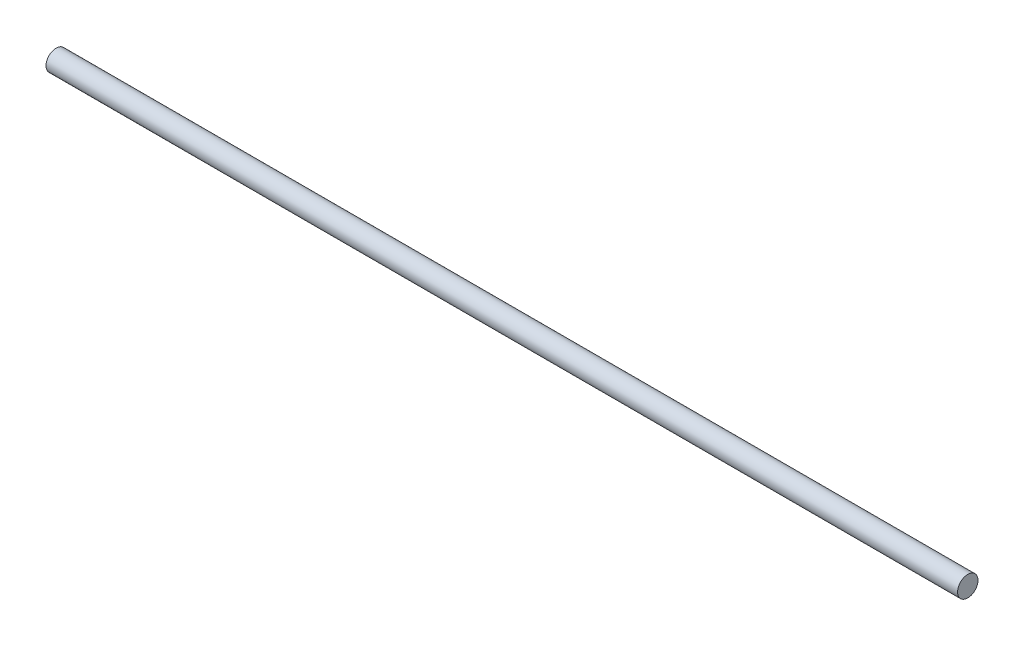
ISO-10303-21;
HEADER;
FILE_DESCRIPTION(('STEP AP214'),'2;1');
FILE_NAME('part.step','',(''),(''),'','','');
FILE_SCHEMA(('AUTOMOTIVE_DESIGN { 1 0 10303 214 1 1 1 1 }'));
ENDSEC;
DATA;
#1=APPLICATION_CONTEXT('core data for automotive mechanical design processes');
#2=APPLICATION_PROTOCOL_DEFINITION('international standard','automotive_design',2000,#1);
#3=PRODUCT_CONTEXT('',#1,'mechanical');
#4=PRODUCT('Part','Part','',(#3));
#5=PRODUCT_RELATED_PRODUCT_CATEGORY('part','',(#4));
#6=PRODUCT_DEFINITION_FORMATION('','',#4);
#7=PRODUCT_DEFINITION_CONTEXT('part definition',#1,'design');
#8=PRODUCT_DEFINITION('design','',#6,#7);
#9=PRODUCT_DEFINITION_SHAPE('','',#8);
#10=(LENGTH_UNIT() NAMED_UNIT(*) SI_UNIT(.MILLI.,.METRE.));
#11=(NAMED_UNIT(*) PLANE_ANGLE_UNIT() SI_UNIT($,.RADIAN.));
#12=(NAMED_UNIT(*) SI_UNIT($,.STERADIAN.) SOLID_ANGLE_UNIT());
#13=UNCERTAINTY_MEASURE_WITH_UNIT(LENGTH_MEASURE(1.E-05),#10,'distance_accuracy_value','');
#14=(GEOMETRIC_REPRESENTATION_CONTEXT(3) GLOBAL_UNCERTAINTY_ASSIGNED_CONTEXT((#13)) GLOBAL_UNIT_ASSIGNED_CONTEXT((#10,
#11,#12)) REPRESENTATION_CONTEXT('',''));
#15=CARTESIAN_POINT('',(0.,0.,0.));
#16=DIRECTION('',(0.,0.,1.));
#17=DIRECTION('',(1.,0.,0.));
#18=AXIS2_PLACEMENT_3D('',#15,#16,#17);
#19=CARTESIAN_POINT('',(178.5,0.,0.));
#20=DIRECTION('',(-1.,0.,0.));
#21=DIRECTION('',(0.,0.,1.));
#22=AXIS2_PLACEMENT_3D('',#19,#20,#21);
#23=CYLINDRICAL_SURFACE('',#22,4.);
#24=CARTESIAN_POINT('',(178.5,0.,0.));
#25=DIRECTION('',(1.,0.,0.));
#26=DIRECTION('',(0.,0.,-1.));
#27=AXIS2_PLACEMENT_3D('',#24,#25,#26);
#28=CIRCLE('',#27,4.);
#29=CARTESIAN_POINT('',(178.5,0.,-4.));
#30=VERTEX_POINT('',#29);
#31=EDGE_CURVE('E10',#30,#30,#28,.T.);
#32=ORIENTED_EDGE('',*,*,#31,.F.);
#33=EDGE_LOOP('',(#32));
#34=FACE_BOUND('',#33,.T.);
#35=CARTESIAN_POINT('',(-178.5,0.,0.));
#36=DIRECTION('',(1.,0.,0.));
#37=DIRECTION('',(0.,0.,-1.));
#38=AXIS2_PLACEMENT_3D('',#35,#36,#37);
#39=CIRCLE('',#38,4.);
#40=CARTESIAN_POINT('',(-178.5,0.,-4.));
#41=VERTEX_POINT('',#40);
#42=EDGE_CURVE('E35',#41,#41,#39,.T.);
#43=ORIENTED_EDGE('',*,*,#42,.T.);
#44=EDGE_LOOP('',(#43));
#45=FACE_BOUND('',#44,.T.);
#46=ADVANCED_FACE('F32',(#34,#45),#23,.T.);
#47=CARTESIAN_POINT('',(178.5,0.,0.));
#48=DIRECTION('',(1.,0.,0.));
#49=DIRECTION('',(0.,0.,-1.));
#50=AXIS2_PLACEMENT_3D('',#47,#48,#49);
#51=PLANE('',#50);
#52=ORIENTED_EDGE('',*,*,#31,.T.);
#53=EDGE_LOOP('',(#52));
#54=FACE_BOUND('',#53,.T.);
#55=ADVANCED_FACE('F47',(#54),#51,.T.);
#56=CARTESIAN_POINT('',(-178.5,0.,0.));
#57=DIRECTION('',(1.,0.,0.));
#58=DIRECTION('',(0.,0.,-1.));
#59=AXIS2_PLACEMENT_3D('',#56,#57,#58);
#60=PLANE('',#59);
#61=ORIENTED_EDGE('',*,*,#42,.F.);
#62=EDGE_LOOP('',(#61));
#63=FACE_BOUND('',#62,.T.);
#64=ADVANCED_FACE('F45',(#63),#60,.F.);
#65=CLOSED_SHELL('',(#46,#55,#64));
#66=MANIFOLD_SOLID_BREP('B2',#65);
#67=ADVANCED_BREP_SHAPE_REPRESENTATION('',(#18,#66),#14);
#68=SHAPE_DEFINITION_REPRESENTATION(#9,#67);
ENDSEC;
END-ISO-10303-21;
